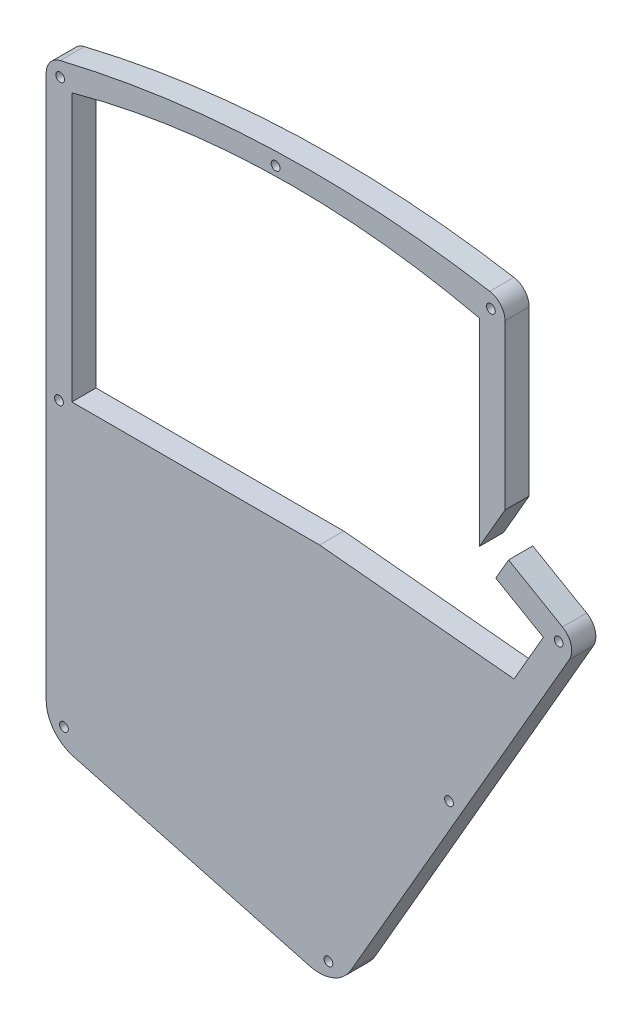
ISO-10303-21;
HEADER;
FILE_DESCRIPTION(('STEP AP214'),'2;1');
FILE_NAME('part.step','',(''),(''),'','','');
FILE_SCHEMA(('AUTOMOTIVE_DESIGN { 1 0 10303 214 1 1 1 1 }'));
ENDSEC;
DATA;
#1=APPLICATION_CONTEXT('core data for automotive mechanical design processes');
#2=APPLICATION_PROTOCOL_DEFINITION('international standard','automotive_design',2000,#1);
#3=PRODUCT_CONTEXT('',#1,'mechanical');
#4=PRODUCT('Part','Part','',(#3));
#5=PRODUCT_RELATED_PRODUCT_CATEGORY('part','',(#4));
#6=PRODUCT_DEFINITION_FORMATION('','',#4);
#7=PRODUCT_DEFINITION_CONTEXT('part definition',#1,'design');
#8=PRODUCT_DEFINITION('design','',#6,#7);
#9=PRODUCT_DEFINITION_SHAPE('','',#8);
#10=(LENGTH_UNIT() NAMED_UNIT(*) SI_UNIT(.MILLI.,.METRE.));
#11=(NAMED_UNIT(*) PLANE_ANGLE_UNIT() SI_UNIT($,.RADIAN.));
#12=(NAMED_UNIT(*) SI_UNIT($,.STERADIAN.) SOLID_ANGLE_UNIT());
#13=UNCERTAINTY_MEASURE_WITH_UNIT(LENGTH_MEASURE(1.E-05),#10,'distance_accuracy_value','');
#14=(GEOMETRIC_REPRESENTATION_CONTEXT(3) GLOBAL_UNCERTAINTY_ASSIGNED_CONTEXT((#13)) GLOBAL_UNIT_ASSIGNED_CONTEXT((#10,
#11,#12)) REPRESENTATION_CONTEXT('',''));
#15=CARTESIAN_POINT('',(0.,0.,0.));
#16=DIRECTION('',(0.,0.,1.));
#17=DIRECTION('',(1.,0.,0.));
#18=AXIS2_PLACEMENT_3D('',#15,#16,#17);
#19=CARTESIAN_POINT('',(125.71136232889,38.9855806030634,-6.6));
#20=DIRECTION('',(1.,0.,0.));
#21=DIRECTION('',(0.,0.,-1.));
#22=AXIS2_PLACEMENT_3D('',#19,#20,#21);
#23=PLANE('',#22);
#24=DIRECTION('',(0.,1.,0.));
#25=VECTOR('',#24,1.);
#26=CARTESIAN_POINT('',(125.71136232889,38.9855806030634,0.));
#27=LINE('',#26,#25);
#28=CARTESIAN_POINT('',(125.71136232889,49.7135406162242,0.));
#29=VERTEX_POINT('',#28);
#30=CARTESIAN_POINT('',(125.71136232889,94.4173790936413,0.));
#31=VERTEX_POINT('',#30);
#32=EDGE_CURVE('E201',#29,#31,#27,.T.);
#33=ORIENTED_EDGE('',*,*,#32,.F.);
#34=DIRECTION('',(0.,0.,-1.));
#35=VECTOR('',#34,1.);
#36=CARTESIAN_POINT('',(125.71136232889,49.7135406162242,-6.6));
#37=LINE('',#36,#35);
#38=CARTESIAN_POINT('',(125.71136232889,49.7135406162242,-6.6));
#39=VERTEX_POINT('',#38);
#40=EDGE_CURVE('E194',#39,#29,#37,.F.);
#41=ORIENTED_EDGE('',*,*,#40,.F.);
#42=DIRECTION('',(0.,1.,0.));
#43=VECTOR('',#42,1.);
#44=CARTESIAN_POINT('',(125.71136232889,38.9855806030634,-6.6));
#45=LINE('',#44,#43);
#46=CARTESIAN_POINT('',(125.71136232889,94.4173790936413,-6.6));
#47=VERTEX_POINT('',#46);
#48=EDGE_CURVE('E278',#39,#47,#45,.T.);
#49=ORIENTED_EDGE('',*,*,#48,.T.);
#50=DIRECTION('',(0.,0.,1.));
#51=VECTOR('',#50,1.);
#52=CARTESIAN_POINT('',(125.71136232889,94.4173790936413,-6.6));
#53=LINE('',#52,#51);
#54=EDGE_CURVE('E244',#47,#31,#53,.T.);
#55=ORIENTED_EDGE('',*,*,#54,.T.);
#56=EDGE_LOOP('',(#33,#41,#49,#55));
#57=FACE_BOUND('',#56,.T.);
#58=ADVANCED_FACE('F39',(#57),#23,.T.);
#59=CARTESIAN_POINT('',(141.417616366734,29.9175706063536,-6.6));
#60=DIRECTION('',(0.5,0.866025403784439,0.));
#61=DIRECTION('',(-0.866025403784439,0.5,0.));
#62=AXIS2_PLACEMENT_3D('',#59,#60,#61);
#63=PLANE('',#62);
#64=DIRECTION('',(-0.866025403784439,0.5,0.));
#65=VECTOR('',#64,1.);
#66=CARTESIAN_POINT('',(141.417616366734,29.9175706063536,-6.6));
#67=LINE('',#66,#65);
#68=CARTESIAN_POINT('',(141.417616366734,29.9175706063536,-6.6));
#69=VERTEX_POINT('',#68);
#70=CARTESIAN_POINT('',(126.695184502399,38.4175706063536,-6.6));
#71=VERTEX_POINT('',#70);
#72=EDGE_CURVE('E193',#69,#71,#67,.T.);
#73=ORIENTED_EDGE('',*,*,#72,.T.);
#74=DIRECTION('',(0.,0.,-1.));
#75=VECTOR('',#74,1.);
#76=CARTESIAN_POINT('',(126.695184502399,38.4175706063536,-6.6));
#77=LINE('',#76,#75);
#78=CARTESIAN_POINT('',(126.695184502399,38.4175706063536,0.));
#79=VERTEX_POINT('',#78);
#80=EDGE_CURVE('E178',#71,#79,#77,.F.);
#81=ORIENTED_EDGE('',*,*,#80,.T.);
#82=DIRECTION('',(-0.866025403784439,0.5,0.));
#83=VECTOR('',#82,1.);
#84=CARTESIAN_POINT('',(141.417616366734,29.9175706063536,0.));
#85=LINE('',#84,#83);
#86=CARTESIAN_POINT('',(141.417616366734,29.9175706063536,0.));
#87=VERTEX_POINT('',#86);
#88=EDGE_CURVE('E190',#87,#79,#85,.T.);
#89=ORIENTED_EDGE('',*,*,#88,.F.);
#90=DIRECTION('',(0.,0.,1.));
#91=VECTOR('',#90,1.);
#92=CARTESIAN_POINT('',(141.417616366734,29.9175706063536,-6.6));
#93=LINE('',#92,#91);
#94=EDGE_CURVE('E43',#69,#87,#93,.T.);
#95=ORIENTED_EDGE('',*,*,#94,.F.);
#96=EDGE_LOOP('',(#73,#81,#89,#95));
#97=FACE_BOUND('',#96,.T.);
#98=ADVANCED_FACE('F189',(#97),#63,.T.);
#99=CARTESIAN_POINT('',(138.917616366734,25.5874435874314,-6.6));
#100=DIRECTION('',(0.,0.,1.));
#101=DIRECTION('',(1.,0.,0.));
#102=AXIS2_PLACEMENT_3D('',#99,#100,#101);
#103=PLANE('',#102);
#104=CARTESIAN_POINT('',(3.96136232889021,14.788842394294,-6.6));
#105=DIRECTION('',(0.,0.,1.));
#106=DIRECTION('',(1.,0.,0.));
#107=AXIS2_PLACEMENT_3D('',#104,#105,#106);
#108=CIRCLE('',#107,1.2);
#109=CARTESIAN_POINT('',(5.16136232889021,14.788842394294,-6.6));
#110=VERTEX_POINT('',#109);
#111=EDGE_CURVE('E205',#110,#110,#108,.T.);
#112=ORIENTED_EDGE('',*,*,#111,.T.);
#113=EDGE_LOOP('',(#112));
#114=FACE_BOUND('',#113,.T.);
#115=CARTESIAN_POINT('',(5.30456561699719,-61.7478219517398,-6.6));
#116=DIRECTION('',(0.,0.,1.));
#117=DIRECTION('',(1.,0.,0.));
#118=AXIS2_PLACEMENT_3D('',#115,#116,#117);
#119=CIRCLE('',#118,1.2);
#120=CARTESIAN_POINT('',(6.50456561699719,-61.7478219517398,-6.6));
#121=VERTEX_POINT('',#120);
#122=EDGE_CURVE('E287',#121,#121,#119,.T.);
#123=ORIENTED_EDGE('',*,*,#122,.T.);
#124=EDGE_LOOP('',(#123));
#125=FACE_BOUND('',#124,.T.);
#126=CARTESIAN_POINT('',(77.5060257857162,-81.0941448962959,-6.6));
#127=DIRECTION('',(0.,0.,1.));
#128=DIRECTION('',(1.,0.,0.));
#129=AXIS2_PLACEMENT_3D('',#126,#127,#128);
#130=CIRCLE('',#129,1.2);
#131=CARTESIAN_POINT('',(78.7060257857162,-81.0941448962959,-6.6));
#132=VERTEX_POINT('',#131);
#133=EDGE_CURVE('E293',#132,#132,#130,.T.);
#134=ORIENTED_EDGE('',*,*,#133,.T.);
#135=EDGE_LOOP('',(#134));
#136=FACE_BOUND('',#135,.T.);
#137=CARTESIAN_POINT('',(110.432201536176,-26.7507421737706,-6.6));
#138=DIRECTION('',(0.,0.,1.));
#139=DIRECTION('',(1.,0.,0.));
#140=AXIS2_PLACEMENT_3D('',#137,#138,#139);
#141=CIRCLE('',#140,1.2);
#142=CARTESIAN_POINT('',(111.632201536176,-26.7507421737706,-6.6));
#143=VERTEX_POINT('',#142);
#144=EDGE_CURVE('E299',#143,#143,#141,.T.);
#145=ORIENTED_EDGE('',*,*,#144,.T.);
#146=EDGE_LOOP('',(#145));
#147=FACE_BOUND('',#146,.T.);
#148=CARTESIAN_POINT('',(140.366505106168,25.9756721550852,-6.6));
#149=DIRECTION('',(0.,0.,1.));
#150=DIRECTION('',(1.,0.,0.));
#151=AXIS2_PLACEMENT_3D('',#148,#149,#150);
#152=CIRCLE('',#151,1.20000000000001);
#153=CARTESIAN_POINT('',(141.566505106168,25.9756721550852,-6.6));
#154=VERTEX_POINT('',#153);
#155=EDGE_CURVE('E305',#154,#154,#152,.T.);
#156=ORIENTED_EDGE('',*,*,#155,.T.);
#157=EDGE_LOOP('',(#156));
#158=FACE_BOUND('',#157,.T.);
#159=CARTESIAN_POINT('',(121.857138977799,95.3854678658184,-6.6));
#160=DIRECTION('',(0.,0.,1.));
#161=DIRECTION('',(1.,0.,0.));
#162=AXIS2_PLACEMENT_3D('',#159,#160,#161);
#163=CIRCLE('',#162,1.2);
#164=CARTESIAN_POINT('',(123.057138977799,95.3854678658184,-6.6));
#165=VERTEX_POINT('',#164);
#166=EDGE_CURVE('E311',#165,#165,#163,.T.);
#167=ORIENTED_EDGE('',*,*,#166,.T.);
#168=EDGE_LOOP('',(#167));
#169=FACE_BOUND('',#168,.T.);
#170=CARTESIAN_POINT('',(63.0863623288902,99.772576472601,-6.6));
#171=DIRECTION('',(0.,0.,1.));
#172=DIRECTION('',(1.,0.,0.));
#173=AXIS2_PLACEMENT_3D('',#170,#171,#172);
#174=CIRCLE('',#173,1.19999999999999);
#175=CARTESIAN_POINT('',(64.2863623288902,99.772576472601,-6.6));
#176=VERTEX_POINT('',#175);
#177=EDGE_CURVE('E317',#176,#176,#174,.T.);
#178=ORIENTED_EDGE('',*,*,#177,.T.);
#179=EDGE_LOOP('',(#178));
#180=FACE_BOUND('',#179,.T.);
#181=CARTESIAN_POINT('',(4.28253949461192,91.3255067403277,-6.6));
#182=DIRECTION('',(0.,0.,1.));
#183=DIRECTION('',(1.,0.,0.));
#184=AXIS2_PLACEMENT_3D('',#181,#182,#183);
#185=CIRCLE('',#184,1.2);
#186=CARTESIAN_POINT('',(5.48253949461192,91.3255067403277,-6.6));
#187=VERTEX_POINT('',#186);
#188=EDGE_CURVE('E323',#187,#187,#185,.T.);
#189=ORIENTED_EDGE('',*,*,#188,.T.);
#190=EDGE_LOOP('',(#189));
#191=FACE_BOUND('',#190,.T.);
#192=DIRECTION('',(0.5,0.866025403784439,0.));
#193=VECTOR('',#192,1.);
#194=CARTESIAN_POINT('',(115.3160193778,31.7082784628326,-6.6));
#195=LINE('',#194,#193);
#196=CARTESIAN_POINT('',(118.71136232889,37.5891849632421,-6.6));
#197=VERTEX_POINT('',#196);
#198=EDGE_CURVE('E184',#197,#39,#195,.T.);
#199=ORIENTED_EDGE('',*,*,#198,.F.);
#200=DIRECTION('',(0.,-1.,0.));
#201=VECTOR('',#200,1.);
#202=CARTESIAN_POINT('',(118.71136232889,91.6108574570273,-6.6));
#203=LINE('',#202,#201);
#204=CARTESIAN_POINT('',(118.71136232889,91.6108574570272,-6.6));
#205=VERTEX_POINT('',#204);
#206=EDGE_CURVE('E378',#205,#197,#203,.T.);
#207=ORIENTED_EDGE('',*,*,#206,.F.);
#208=CARTESIAN_POINT('',(67.8020092626523,-130.467472598143,-6.6));
#209=DIRECTION('',(0.,0.,1.));
#210=DIRECTION('',(1.,0.,0.));
#211=AXIS2_PLACEMENT_3D('',#208,#209,#210);
#212=CIRCLE('',#211,227.838861719673);
#213=CARTESIAN_POINT('',(7.46136232889021,89.2358574570272,-6.6));
#214=VERTEX_POINT('',#213);
#215=EDGE_CURVE('E375',#214,#205,#212,.F.);
#216=ORIENTED_EDGE('',*,*,#215,.F.);
#217=DIRECTION('',(0.,1.,0.));
#218=VECTOR('',#217,1.);
#219=CARTESIAN_POINT('',(7.46136232889021,16.1358574570272,-6.6));
#220=LINE('',#219,#218);
#221=CARTESIAN_POINT('',(7.46136232889021,16.1358574570272,-6.6));
#222=VERTEX_POINT('',#221);
#223=EDGE_CURVE('E372',#222,#214,#220,.T.);
#224=ORIENTED_EDGE('',*,*,#223,.F.);
#225=DIRECTION('',(-1.,0.,0.));
#226=VECTOR('',#225,1.);
#227=CARTESIAN_POINT('',(75.1123623288902,16.1358574570272,-6.6));
#228=LINE('',#227,#226);
#229=CARTESIAN_POINT('',(75.1123623288902,16.1358574570272,-6.6));
#230=VERTEX_POINT('',#229);
#231=EDGE_CURVE('E369',#230,#222,#228,.T.);
#232=ORIENTED_EDGE('',*,*,#231,.F.);
#233=DIRECTION('',(-0.995348656445925,0.0963382172935161,0.));
#234=VECTOR('',#233,1.);
#235=CARTESIAN_POINT('',(128.185565559165,10.9989863193115,-6.6));
#236=LINE('',#235,#234);
#237=CARTESIAN_POINT('',(128.185565559165,10.9989863193115,-6.6));
#238=VERTEX_POINT('',#237);
#239=EDGE_CURVE('E366',#238,#230,#236,.T.);
#240=ORIENTED_EDGE('',*,*,#239,.F.);
#241=DIRECTION('',(-0.500000000000002,-0.866025403784438,0.));
#242=VECTOR('',#241,1.);
#243=CARTESIAN_POINT('',(136.185565559165,24.8553927798626,-6.6));
#244=LINE('',#243,#242);
#245=CARTESIAN_POINT('',(136.185565559165,24.8553927798626,-6.6));
#246=VERTEX_POINT('',#245);
#247=EDGE_CURVE('E363',#246,#238,#244,.T.);
#248=ORIENTED_EDGE('',*,*,#247,.F.);
#249=DIRECTION('',(0.866025403784439,-0.5,0.));
#250=VECTOR('',#249,1.);
#251=CARTESIAN_POINT('',(118.71136232889,34.9441287187361,-6.6));
#252=LINE('',#251,#250);
#253=CARTESIAN_POINT('',(123.195184502399,32.3553927798626,-6.6));
#254=VERTEX_POINT('',#253);
#255=EDGE_CURVE('E329',#254,#246,#252,.T.);
#256=ORIENTED_EDGE('',*,*,#255,.F.);
#257=DIRECTION('',(-0.5,-0.866025403784439,0.));
#258=VECTOR('',#257,1.);
#259=CARTESIAN_POINT('',(120.945184502399,28.4582784628326,-6.6));
#260=LINE('',#259,#258);
#261=EDGE_CURVE('E64',#71,#254,#260,.T.);
#262=ORIENTED_EDGE('',*,*,#261,.F.);
#263=ORIENTED_EDGE('',*,*,#72,.F.);
#264=CARTESIAN_POINT('',(138.917616366734,25.5874435874314,-6.6));
#265=DIRECTION('',(0.,0.,1.));
#266=DIRECTION('',(1.,0.,0.));
#267=AXIS2_PLACEMENT_3D('',#264,#265,#266);
#268=CIRCLE('',#267,5.00000000000001);
#269=CARTESIAN_POINT('',(143.247743385656,23.0874435874314,-6.6));
#270=VERTEX_POINT('',#269);
#271=EDGE_CURVE('E230',#270,#69,#268,.T.);
#272=ORIENTED_EDGE('',*,*,#271,.F.);
#273=DIRECTION('',(0.5,0.866025403784439,0.));
#274=VECTOR('',#273,1.);
#275=CARTESIAN_POINT('',(83.6788375131875,-80.0889279349726,-6.6));
#276=LINE('',#275,#274);
#277=CARTESIAN_POINT('',(83.6788375131875,-80.0889279349726,-6.6));
#278=VERTEX_POINT('',#277);
#279=EDGE_CURVE('E250',#278,#270,#276,.T.);
#280=ORIENTED_EDGE('',*,*,#279,.F.);
#281=CARTESIAN_POINT('',(75.0185834753431,-75.0889279349726,-6.6));
#282=DIRECTION('',(0.,0.,1.));
#283=DIRECTION('',(1.,0.,0.));
#284=AXIS2_PLACEMENT_3D('',#281,#282,#283);
#285=CIRCLE('',#284,10.);
#286=CARTESIAN_POINT('',(72.430393024318,-84.7481861978633,-6.6));
#287=VERTEX_POINT('',#286);
#288=EDGE_CURVE('E254',#287,#278,#285,.T.);
#289=ORIENTED_EDGE('',*,*,#288,.F.);
#290=DIRECTION('',(0.965925826289068,-0.258819045102521,0.));
#291=VECTOR('',#290,1.);
#292=CARTESIAN_POINT('',(7.87317187786502,-67.4501309260738,-6.6));
#293=LINE('',#292,#291);
#294=CARTESIAN_POINT('',(7.87317187786502,-67.4501309260738,-6.6));
#295=VERTEX_POINT('',#294);
#296=EDGE_CURVE('E258',#295,#287,#293,.T.);
#297=ORIENTED_EDGE('',*,*,#296,.F.);
#298=CARTESIAN_POINT('',(10.4613623288902,-57.7908726631831,-6.6));
#299=DIRECTION('',(0.,0.,1.));
#300=DIRECTION('',(1.,0.,0.));
#301=AXIS2_PLACEMENT_3D('',#298,#299,#300);
#302=CIRCLE('',#301,10.);
#303=CARTESIAN_POINT('',(0.461362328890224,-57.7908726631831,-6.6));
#304=VERTEX_POINT('',#303);
#305=EDGE_CURVE('E263',#304,#295,#302,.T.);
#306=ORIENTED_EDGE('',*,*,#305,.F.);
#307=DIRECTION('',(0.,-1.,0.));
#308=VECTOR('',#307,1.);
#309=CARTESIAN_POINT('',(0.461362328890208,90.3979417963027,-6.6));
#310=LINE('',#309,#308);
#311=CARTESIAN_POINT('',(0.461362328890208,90.3979417963027,-6.6));
#312=VERTEX_POINT('',#311);
#313=EDGE_CURVE('E266',#312,#304,#310,.T.);
#314=ORIENTED_EDGE('',*,*,#313,.F.);
#315=CARTESIAN_POINT('',(5.46136232889022,90.3979417963027,-6.6));
#316=DIRECTION('',(0.,0.,1.));
#317=DIRECTION('',(-1.,0.,0.));
#318=AXIS2_PLACEMENT_3D('',#315,#316,#317);
#319=CIRCLE('',#318,5.00000000000001);
#320=CARTESIAN_POINT('',(4.28525888615277,95.2576517353815,-6.6));
#321=VERTEX_POINT('',#320);
#322=EDGE_CURVE('E269',#321,#312,#319,.T.);
#323=ORIENTED_EDGE('',*,*,#322,.F.);
#324=CARTESIAN_POINT('',(72.8707016909715,-188.14034368151,-6.6));
#325=DIRECTION('',(0.,0.,1.));
#326=DIRECTION('',(-1.,0.,0.));
#327=AXIS2_PLACEMENT_3D('',#324,#325,#326);
#328=CIRCLE('',#327,291.579126089378);
#329=CARTESIAN_POINT('',(121.546047347488,99.3472169124471,-6.6));
#330=VERTEX_POINT('',#329);
#331=EDGE_CURVE('E272',#330,#321,#328,.T.);
#332=ORIENTED_EDGE('',*,*,#331,.F.);
#333=CARTESIAN_POINT('',(120.71136232889,94.4173790936413,-6.6));
#334=DIRECTION('',(0.,0.,1.));
#335=DIRECTION('',(1.,0.,0.));
#336=AXIS2_PLACEMENT_3D('',#333,#334,#335);
#337=CIRCLE('',#336,5.00000000000001);
#338=EDGE_CURVE('E275',#47,#330,#337,.T.);
#339=ORIENTED_EDGE('',*,*,#338,.F.);
#340=ORIENTED_EDGE('',*,*,#48,.F.);
#341=EDGE_LOOP('',(#199,#207,#216,#224,#232,#240,#248,#256,#262,#263,#272,#280,#289,#297,#306,
#314,#323,#332,#339,#340));
#342=FACE_BOUND('',#341,.T.);
#343=ADVANCED_FACE('F393',(#114,#125,#136,#147,#158,#169,#180,#191,#342),#103,.F.);
#344=CARTESIAN_POINT('',(138.917616366734,25.5874435874314,0.));
#345=DIRECTION('',(0.,0.,1.));
#346=DIRECTION('',(1.,0.,0.));
#347=AXIS2_PLACEMENT_3D('',#344,#345,#346);
#348=PLANE('',#347);
#349=CARTESIAN_POINT('',(4.28253949461192,91.3255067403277,0.));
#350=DIRECTION('',(0.,0.,1.));
#351=DIRECTION('',(1.,0.,0.));
#352=AXIS2_PLACEMENT_3D('',#349,#350,#351);
#353=CIRCLE('',#352,1.2);
#354=CARTESIAN_POINT('',(5.48253949461192,91.3255067403277,0.));
#355=VERTEX_POINT('',#354);
#356=EDGE_CURVE('E326',#355,#355,#353,.T.);
#357=ORIENTED_EDGE('',*,*,#356,.F.);
#358=EDGE_LOOP('',(#357));
#359=FACE_BOUND('',#358,.T.);
#360=CARTESIAN_POINT('',(63.0863623288902,99.772576472601,0.));
#361=DIRECTION('',(0.,0.,1.));
#362=DIRECTION('',(1.,0.,0.));
#363=AXIS2_PLACEMENT_3D('',#360,#361,#362);
#364=CIRCLE('',#363,1.19999999999999);
#365=CARTESIAN_POINT('',(64.2863623288902,99.772576472601,0.));
#366=VERTEX_POINT('',#365);
#367=EDGE_CURVE('E320',#366,#366,#364,.T.);
#368=ORIENTED_EDGE('',*,*,#367,.F.);
#369=EDGE_LOOP('',(#368));
#370=FACE_BOUND('',#369,.T.);
#371=CARTESIAN_POINT('',(121.857138977799,95.3854678658184,0.));
#372=DIRECTION('',(0.,0.,1.));
#373=DIRECTION('',(1.,0.,0.));
#374=AXIS2_PLACEMENT_3D('',#371,#372,#373);
#375=CIRCLE('',#374,1.20000000000001);
#376=CARTESIAN_POINT('',(123.057138977799,95.3854678658184,0.));
#377=VERTEX_POINT('',#376);
#378=EDGE_CURVE('E314',#377,#377,#375,.T.);
#379=ORIENTED_EDGE('',*,*,#378,.F.);
#380=EDGE_LOOP('',(#379));
#381=FACE_BOUND('',#380,.T.);
#382=CARTESIAN_POINT('',(140.366505106168,25.9756721550852,0.));
#383=DIRECTION('',(0.,0.,1.));
#384=DIRECTION('',(1.,0.,0.));
#385=AXIS2_PLACEMENT_3D('',#382,#383,#384);
#386=CIRCLE('',#385,1.20000000000001);
#387=CARTESIAN_POINT('',(141.566505106168,25.9756721550852,0.));
#388=VERTEX_POINT('',#387);
#389=EDGE_CURVE('E308',#388,#388,#386,.T.);
#390=ORIENTED_EDGE('',*,*,#389,.F.);
#391=EDGE_LOOP('',(#390));
#392=FACE_BOUND('',#391,.T.);
#393=CARTESIAN_POINT('',(110.432201536176,-26.7507421737706,0.));
#394=DIRECTION('',(0.,0.,1.));
#395=DIRECTION('',(1.,0.,0.));
#396=AXIS2_PLACEMENT_3D('',#393,#394,#395);
#397=CIRCLE('',#396,1.20000000000001);
#398=CARTESIAN_POINT('',(111.632201536176,-26.7507421737706,0.));
#399=VERTEX_POINT('',#398);
#400=EDGE_CURVE('E302',#399,#399,#397,.T.);
#401=ORIENTED_EDGE('',*,*,#400,.F.);
#402=EDGE_LOOP('',(#401));
#403=FACE_BOUND('',#402,.T.);
#404=CARTESIAN_POINT('',(77.5060257857162,-81.0941448962959,0.));
#405=DIRECTION('',(0.,0.,1.));
#406=DIRECTION('',(1.,0.,0.));
#407=AXIS2_PLACEMENT_3D('',#404,#405,#406);
#408=CIRCLE('',#407,1.20000000000001);
#409=CARTESIAN_POINT('',(78.7060257857162,-81.0941448962959,0.));
#410=VERTEX_POINT('',#409);
#411=EDGE_CURVE('E296',#410,#410,#408,.T.);
#412=ORIENTED_EDGE('',*,*,#411,.F.);
#413=EDGE_LOOP('',(#412));
#414=FACE_BOUND('',#413,.T.);
#415=CARTESIAN_POINT('',(5.30456561699719,-61.7478219517398,0.));
#416=DIRECTION('',(0.,0.,1.));
#417=DIRECTION('',(1.,0.,0.));
#418=AXIS2_PLACEMENT_3D('',#415,#416,#417);
#419=CIRCLE('',#418,1.2);
#420=CARTESIAN_POINT('',(6.50456561699719,-61.7478219517398,0.));
#421=VERTEX_POINT('',#420);
#422=EDGE_CURVE('E290',#421,#421,#419,.T.);
#423=ORIENTED_EDGE('',*,*,#422,.F.);
#424=EDGE_LOOP('',(#423));
#425=FACE_BOUND('',#424,.T.);
#426=CARTESIAN_POINT('',(3.96136232889021,14.788842394294,0.));
#427=DIRECTION('',(0.,0.,1.));
#428=DIRECTION('',(1.,0.,0.));
#429=AXIS2_PLACEMENT_3D('',#426,#427,#428);
#430=CIRCLE('',#429,1.2);
#431=CARTESIAN_POINT('',(5.16136232889021,14.788842394294,0.));
#432=VERTEX_POINT('',#431);
#433=EDGE_CURVE('E284',#432,#432,#430,.T.);
#434=ORIENTED_EDGE('',*,*,#433,.F.);
#435=EDGE_LOOP('',(#434));
#436=FACE_BOUND('',#435,.T.);
#437=DIRECTION('',(0.,1.,0.));
#438=VECTOR('',#437,1.);
#439=CARTESIAN_POINT('',(118.71136232889,91.6108574570273,0.));
#440=LINE('',#439,#438);
#441=CARTESIAN_POINT('',(118.71136232889,37.5891849632421,0.));
#442=VERTEX_POINT('',#441);
#443=CARTESIAN_POINT('',(118.71136232889,91.6108574570272,0.));
#444=VERTEX_POINT('',#443);
#445=EDGE_CURVE('E357',#442,#444,#440,.T.);
#446=ORIENTED_EDGE('',*,*,#445,.F.);
#447=DIRECTION('',(0.5,0.866025403784439,0.));
#448=VECTOR('',#447,1.);
#449=CARTESIAN_POINT('',(115.3160193778,31.7082784628326,0.));
#450=LINE('',#449,#448);
#451=EDGE_CURVE('E56',#442,#29,#450,.T.);
#452=ORIENTED_EDGE('',*,*,#451,.T.);
#453=ORIENTED_EDGE('',*,*,#32,.T.);
#454=CARTESIAN_POINT('',(120.71136232889,94.4173790936413,0.));
#455=DIRECTION('',(0.,0.,1.));
#456=DIRECTION('',(1.,0.,0.));
#457=AXIS2_PLACEMENT_3D('',#454,#455,#456);
#458=CIRCLE('',#457,5.00000000000001);
#459=CARTESIAN_POINT('',(121.546047347488,99.3472169124471,0.));
#460=VERTEX_POINT('',#459);
#461=EDGE_CURVE('E203',#31,#460,#458,.T.);
#462=ORIENTED_EDGE('',*,*,#461,.T.);
#463=CARTESIAN_POINT('',(72.8707016909715,-188.14034368151,0.));
#464=DIRECTION('',(0.,0.,1.));
#465=DIRECTION('',(-1.,0.,0.));
#466=AXIS2_PLACEMENT_3D('',#463,#464,#465);
#467=CIRCLE('',#466,291.579126089378);
#468=CARTESIAN_POINT('',(4.28525888615277,95.2576517353815,0.));
#469=VERTEX_POINT('',#468);
#470=EDGE_CURVE('E211',#460,#469,#467,.T.);
#471=ORIENTED_EDGE('',*,*,#470,.T.);
#472=CARTESIAN_POINT('',(5.46136232889022,90.3979417963027,0.));
#473=DIRECTION('',(0.,0.,1.));
#474=DIRECTION('',(-1.,0.,0.));
#475=AXIS2_PLACEMENT_3D('',#472,#473,#474);
#476=CIRCLE('',#475,5.00000000000001);
#477=CARTESIAN_POINT('',(0.461362328890208,90.3979417963027,0.));
#478=VERTEX_POINT('',#477);
#479=EDGE_CURVE('E214',#469,#478,#476,.T.);
#480=ORIENTED_EDGE('',*,*,#479,.T.);
#481=DIRECTION('',(0.,-1.,0.));
#482=VECTOR('',#481,1.);
#483=CARTESIAN_POINT('',(0.461362328890208,90.3979417963027,0.));
#484=LINE('',#483,#482);
#485=CARTESIAN_POINT('',(0.461362328890224,-57.7908726631831,0.));
#486=VERTEX_POINT('',#485);
#487=EDGE_CURVE('E217',#478,#486,#484,.T.);
#488=ORIENTED_EDGE('',*,*,#487,.T.);
#489=CARTESIAN_POINT('',(10.4613623288902,-57.7908726631831,0.));
#490=DIRECTION('',(0.,0.,1.));
#491=DIRECTION('',(1.,0.,0.));
#492=AXIS2_PLACEMENT_3D('',#489,#490,#491);
#493=CIRCLE('',#492,10.);
#494=CARTESIAN_POINT('',(7.87317187786502,-67.4501309260738,0.));
#495=VERTEX_POINT('',#494);
#496=EDGE_CURVE('E220',#486,#495,#493,.T.);
#497=ORIENTED_EDGE('',*,*,#496,.T.);
#498=DIRECTION('',(0.965925826289068,-0.258819045102521,0.));
#499=VECTOR('',#498,1.);
#500=CARTESIAN_POINT('',(7.87317187786502,-67.4501309260738,0.));
#501=LINE('',#500,#499);
#502=CARTESIAN_POINT('',(72.430393024318,-84.7481861978633,0.));
#503=VERTEX_POINT('',#502);
#504=EDGE_CURVE('E223',#495,#503,#501,.T.);
#505=ORIENTED_EDGE('',*,*,#504,.T.);
#506=CARTESIAN_POINT('',(75.0185834753431,-75.0889279349726,0.));
#507=DIRECTION('',(0.,0.,1.));
#508=DIRECTION('',(1.,0.,0.));
#509=AXIS2_PLACEMENT_3D('',#506,#507,#508);
#510=CIRCLE('',#509,10.);
#511=CARTESIAN_POINT('',(83.6788375131875,-80.0889279349726,0.));
#512=VERTEX_POINT('',#511);
#513=EDGE_CURVE('E226',#503,#512,#510,.T.);
#514=ORIENTED_EDGE('',*,*,#513,.T.);
#515=DIRECTION('',(0.5,0.866025403784439,0.));
#516=VECTOR('',#515,1.);
#517=CARTESIAN_POINT('',(83.6788375131875,-80.0889279349726,0.));
#518=LINE('',#517,#516);
#519=CARTESIAN_POINT('',(143.247743385656,23.0874435874314,0.));
#520=VERTEX_POINT('',#519);
#521=EDGE_CURVE('E229',#512,#520,#518,.T.);
#522=ORIENTED_EDGE('',*,*,#521,.T.);
#523=CARTESIAN_POINT('',(138.917616366734,25.5874435874314,0.));
#524=DIRECTION('',(0.,0.,1.));
#525=DIRECTION('',(1.,0.,0.));
#526=AXIS2_PLACEMENT_3D('',#523,#524,#525);
#527=CIRCLE('',#526,5.00000000000001);
#528=EDGE_CURVE('E200',#520,#87,#527,.T.);
#529=ORIENTED_EDGE('',*,*,#528,.T.);
#530=ORIENTED_EDGE('',*,*,#88,.T.);
#531=DIRECTION('',(-0.5,-0.866025403784439,0.));
#532=VECTOR('',#531,1.);
#533=CARTESIAN_POINT('',(120.945184502399,28.4582784628326,0.));
#534=LINE('',#533,#532);
#535=CARTESIAN_POINT('',(123.195184502399,32.3553927798626,0.));
#536=VERTEX_POINT('',#535);
#537=EDGE_CURVE('E175',#79,#536,#534,.T.);
#538=ORIENTED_EDGE('',*,*,#537,.T.);
#539=DIRECTION('',(-0.866025403784439,0.5,0.));
#540=VECTOR('',#539,1.);
#541=CARTESIAN_POINT('',(118.71136232889,34.9441287187361,0.));
#542=LINE('',#541,#540);
#543=CARTESIAN_POINT('',(136.185565559165,24.8553927798625,0.));
#544=VERTEX_POINT('',#543);
#545=EDGE_CURVE('E359',#544,#536,#542,.T.);
#546=ORIENTED_EDGE('',*,*,#545,.F.);
#547=DIRECTION('',(0.500000000000002,0.866025403784438,0.));
#548=VECTOR('',#547,1.);
#549=CARTESIAN_POINT('',(136.185565559165,24.8553927798626,0.));
#550=LINE('',#549,#548);
#551=CARTESIAN_POINT('',(128.185565559165,10.9989863193115,0.));
#552=VERTEX_POINT('',#551);
#553=EDGE_CURVE('E361',#552,#544,#550,.T.);
#554=ORIENTED_EDGE('',*,*,#553,.F.);
#555=DIRECTION('',(0.995348656445925,-0.0963382172935161,0.));
#556=VECTOR('',#555,1.);
#557=CARTESIAN_POINT('',(128.185565559165,10.9989863193115,0.));
#558=LINE('',#557,#556);
#559=CARTESIAN_POINT('',(75.1123623288902,16.1358574570272,0.));
#560=VERTEX_POINT('',#559);
#561=EDGE_CURVE('E336',#560,#552,#558,.T.);
#562=ORIENTED_EDGE('',*,*,#561,.F.);
#563=DIRECTION('',(1.,0.,0.));
#564=VECTOR('',#563,1.);
#565=CARTESIAN_POINT('',(75.1123623288902,16.1358574570272,0.));
#566=LINE('',#565,#564);
#567=CARTESIAN_POINT('',(7.46136232889021,16.1358574570272,0.));
#568=VERTEX_POINT('',#567);
#569=EDGE_CURVE('E348',#568,#560,#566,.T.);
#570=ORIENTED_EDGE('',*,*,#569,.F.);
#571=DIRECTION('',(0.,-1.,0.));
#572=VECTOR('',#571,1.);
#573=CARTESIAN_POINT('',(7.46136232889021,16.1358574570272,0.));
#574=LINE('',#573,#572);
#575=CARTESIAN_POINT('',(7.46136232889021,89.2358574570272,0.));
#576=VERTEX_POINT('',#575);
#577=EDGE_CURVE('E351',#576,#568,#574,.T.);
#578=ORIENTED_EDGE('',*,*,#577,.F.);
#579=CARTESIAN_POINT('',(67.8020092626523,-130.467472598143,0.));
#580=DIRECTION('',(0.,0.,1.));
#581=DIRECTION('',(-1.,0.,0.));
#582=AXIS2_PLACEMENT_3D('',#579,#580,#581);
#583=CIRCLE('',#582,227.838861719673);
#584=EDGE_CURVE('E354',#444,#576,#583,.T.);
#585=ORIENTED_EDGE('',*,*,#584,.F.);
#586=EDGE_LOOP('',(#446,#452,#453,#462,#471,#480,#488,#497,#505,#514,#522,#529,#530,#538,#546,
#554,#562,#570,#578,#585));
#587=FACE_BOUND('',#586,.T.);
#588=ADVANCED_FACE('F197',(#359,#370,#381,#392,#403,#414,#425,#436,#587),#348,.T.);
#589=CARTESIAN_POINT('',(118.71136232889,91.6108574570273,-6.601));
#590=DIRECTION('',(1.,0.,0.));
#591=DIRECTION('',(0.,0.,-1.));
#592=AXIS2_PLACEMENT_3D('',#589,#590,#591);
#593=PLANE('',#592);
#594=DIRECTION('',(0.,0.,-1.));
#595=VECTOR('',#594,1.);
#596=CARTESIAN_POINT('',(118.71136232889,37.5891849632421,-6.6));
#597=LINE('',#596,#595);
#598=EDGE_CURVE('E381',#197,#442,#597,.F.);
#599=ORIENTED_EDGE('',*,*,#598,.T.);
#600=ORIENTED_EDGE('',*,*,#445,.T.);
#601=DIRECTION('',(0.,0.,1.));
#602=VECTOR('',#601,1.);
#603=CARTESIAN_POINT('',(118.71136232889,91.6108574570272,-6.601));
#604=LINE('',#603,#602);
#605=EDGE_CURVE('E335',#205,#444,#604,.T.);
#606=ORIENTED_EDGE('',*,*,#605,.F.);
#607=ORIENTED_EDGE('',*,*,#206,.T.);
#608=EDGE_LOOP('',(#599,#600,#606,#607));
#609=FACE_BOUND('',#608,.T.);
#610=ADVANCED_FACE('F431',(#609),#593,.F.);
#611=CARTESIAN_POINT('',(118.71136232889,34.9441287187361,-6.601));
#612=DIRECTION('',(0.499999999999999,0.866025403784439,0.));
#613=DIRECTION('',(-0.866025403784439,0.5,0.));
#614=AXIS2_PLACEMENT_3D('',#611,#612,#613);
#615=PLANE('',#614);
#616=DIRECTION('',(0.,0.,-1.));
#617=VECTOR('',#616,1.);
#618=CARTESIAN_POINT('',(123.195184502399,32.3553927798626,-6.6));
#619=LINE('',#618,#617);
#620=EDGE_CURVE('E179',#254,#536,#619,.F.);
#621=ORIENTED_EDGE('',*,*,#620,.F.);
#622=ORIENTED_EDGE('',*,*,#255,.T.);
#623=DIRECTION('',(0.,0.,1.));
#624=VECTOR('',#623,1.);
#625=CARTESIAN_POINT('',(136.185565559165,24.8553927798626,-6.601));
#626=LINE('',#625,#624);
#627=EDGE_CURVE('E332',#246,#544,#626,.T.);
#628=ORIENTED_EDGE('',*,*,#627,.T.);
#629=ORIENTED_EDGE('',*,*,#545,.T.);
#630=EDGE_LOOP('',(#621,#622,#628,#629));
#631=FACE_BOUND('',#630,.T.);
#632=ADVANCED_FACE('F425',(#631),#615,.F.);
#633=CARTESIAN_POINT('',(138.917616366734,25.5874435874314,-6.6));
#634=DIRECTION('',(0.,0.,1.));
#635=DIRECTION('',(1.,0.,0.));
#636=AXIS2_PLACEMENT_3D('',#633,#634,#635);
#637=CYLINDRICAL_SURFACE('',#636,5.00000000000001);
#638=ORIENTED_EDGE('',*,*,#528,.F.);
#639=DIRECTION('',(0.,0.,1.));
#640=VECTOR('',#639,1.);
#641=CARTESIAN_POINT('',(143.247743385656,23.0874435874314,-6.6));
#642=LINE('',#641,#640);
#643=EDGE_CURVE('E11',#270,#520,#642,.T.);
#644=ORIENTED_EDGE('',*,*,#643,.F.);
#645=ORIENTED_EDGE('',*,*,#271,.T.);
#646=ORIENTED_EDGE('',*,*,#94,.T.);
#647=EDGE_LOOP('',(#638,#644,#645,#646));
#648=FACE_BOUND('',#647,.T.);
#649=ADVANCED_FACE('F41',(#648),#637,.T.);
#650=CARTESIAN_POINT('',(83.6788375131875,-80.0889279349726,-6.6));
#651=DIRECTION('',(0.866025403784439,-0.5,0.));
#652=DIRECTION('',(0.5,0.866025403784439,0.));
#653=AXIS2_PLACEMENT_3D('',#650,#651,#652);
#654=PLANE('',#653);
#655=ORIENTED_EDGE('',*,*,#521,.F.);
#656=DIRECTION('',(0.,0.,1.));
#657=VECTOR('',#656,1.);
#658=CARTESIAN_POINT('',(83.6788375131875,-80.0889279349726,-6.6));
#659=LINE('',#658,#657);
#660=EDGE_CURVE('E48',#278,#512,#659,.T.);
#661=ORIENTED_EDGE('',*,*,#660,.F.);
#662=ORIENTED_EDGE('',*,*,#279,.T.);
#663=ORIENTED_EDGE('',*,*,#643,.T.);
#664=EDGE_LOOP('',(#655,#661,#662,#663));
#665=FACE_BOUND('',#664,.T.);
#666=ADVANCED_FACE('F422',(#665),#654,.T.);
#667=CARTESIAN_POINT('',(75.0185834753431,-75.0889279349726,-6.6));
#668=DIRECTION('',(0.,0.,1.));
#669=DIRECTION('',(1.,0.,0.));
#670=AXIS2_PLACEMENT_3D('',#667,#668,#669);
#671=CYLINDRICAL_SURFACE('',#670,10.);
#672=ORIENTED_EDGE('',*,*,#513,.F.);
#673=DIRECTION('',(0.,0.,1.));
#674=VECTOR('',#673,1.);
#675=CARTESIAN_POINT('',(72.430393024318,-84.7481861978633,-6.6));
#676=LINE('',#675,#674);
#677=EDGE_CURVE('E233',#287,#503,#676,.T.);
#678=ORIENTED_EDGE('',*,*,#677,.F.);
#679=ORIENTED_EDGE('',*,*,#288,.T.);
#680=ORIENTED_EDGE('',*,*,#660,.T.);
#681=EDGE_LOOP('',(#672,#678,#679,#680));
#682=FACE_BOUND('',#681,.T.);
#683=ADVANCED_FACE('F420',(#682),#671,.T.);
#684=CARTESIAN_POINT('',(7.87317187786502,-67.4501309260738,-6.6));
#685=DIRECTION('',(-0.258819045102521,-0.965925826289068,0.));
#686=DIRECTION('',(0.965925826289068,-0.258819045102521,0.));
#687=AXIS2_PLACEMENT_3D('',#684,#685,#686);
#688=PLANE('',#687);
#689=ORIENTED_EDGE('',*,*,#504,.F.);
#690=DIRECTION('',(0.,0.,1.));
#691=VECTOR('',#690,1.);
#692=CARTESIAN_POINT('',(7.87317187786502,-67.4501309260738,-6.6));
#693=LINE('',#692,#691);
#694=EDGE_CURVE('E235',#295,#495,#693,.T.);
#695=ORIENTED_EDGE('',*,*,#694,.F.);
#696=ORIENTED_EDGE('',*,*,#296,.T.);
#697=ORIENTED_EDGE('',*,*,#677,.T.);
#698=EDGE_LOOP('',(#689,#695,#696,#697));
#699=FACE_BOUND('',#698,.T.);
#700=ADVANCED_FACE('F416',(#699),#688,.T.);
#701=CARTESIAN_POINT('',(10.4613623288902,-57.7908726631831,-6.6));
#702=DIRECTION('',(0.,0.,1.));
#703=DIRECTION('',(1.,0.,0.));
#704=AXIS2_PLACEMENT_3D('',#701,#702,#703);
#705=CYLINDRICAL_SURFACE('',#704,10.);
#706=ORIENTED_EDGE('',*,*,#496,.F.);
#707=DIRECTION('',(0.,0.,1.));
#708=VECTOR('',#707,1.);
#709=CARTESIAN_POINT('',(0.461362328890224,-57.7908726631831,-6.6));
#710=LINE('',#709,#708);
#711=EDGE_CURVE('E237',#304,#486,#710,.T.);
#712=ORIENTED_EDGE('',*,*,#711,.F.);
#713=ORIENTED_EDGE('',*,*,#305,.T.);
#714=ORIENTED_EDGE('',*,*,#694,.T.);
#715=EDGE_LOOP('',(#706,#712,#713,#714));
#716=FACE_BOUND('',#715,.T.);
#717=ADVANCED_FACE('F412',(#716),#705,.T.);
#718=CARTESIAN_POINT('',(0.461362328890208,90.3979417963027,-6.6));
#719=DIRECTION('',(-1.,0.,0.));
#720=DIRECTION('',(0.,-1.,0.));
#721=AXIS2_PLACEMENT_3D('',#718,#719,#720);
#722=PLANE('',#721);
#723=ORIENTED_EDGE('',*,*,#487,.F.);
#724=DIRECTION('',(0.,0.,1.));
#725=VECTOR('',#724,1.);
#726=CARTESIAN_POINT('',(0.461362328890208,90.3979417963027,-6.6));
#727=LINE('',#726,#725);
#728=EDGE_CURVE('E239',#312,#478,#727,.T.);
#729=ORIENTED_EDGE('',*,*,#728,.F.);
#730=ORIENTED_EDGE('',*,*,#313,.T.);
#731=ORIENTED_EDGE('',*,*,#711,.T.);
#732=EDGE_LOOP('',(#723,#729,#730,#731));
#733=FACE_BOUND('',#732,.T.);
#734=ADVANCED_FACE('F408',(#733),#722,.T.);
#735=CARTESIAN_POINT('',(5.46136232889022,90.3979417963027,-6.6));
#736=DIRECTION('',(0.,0.,1.));
#737=DIRECTION('',(1.,0.,0.));
#738=AXIS2_PLACEMENT_3D('',#735,#736,#737);
#739=CYLINDRICAL_SURFACE('',#738,5.00000000000001);
#740=ORIENTED_EDGE('',*,*,#479,.F.);
#741=DIRECTION('',(0.,0.,1.));
#742=VECTOR('',#741,1.);
#743=CARTESIAN_POINT('',(4.28525888615277,95.2576517353815,-6.6));
#744=LINE('',#743,#742);
#745=EDGE_CURVE('E241',#321,#469,#744,.T.);
#746=ORIENTED_EDGE('',*,*,#745,.F.);
#747=ORIENTED_EDGE('',*,*,#322,.T.);
#748=ORIENTED_EDGE('',*,*,#728,.T.);
#749=EDGE_LOOP('',(#740,#746,#747,#748));
#750=FACE_BOUND('',#749,.T.);
#751=ADVANCED_FACE('F404',(#750),#739,.T.);
#752=CARTESIAN_POINT('',(72.8707016909715,-188.14034368151,-6.6));
#753=DIRECTION('',(0.,0.,1.));
#754=DIRECTION('',(1.,0.,0.));
#755=AXIS2_PLACEMENT_3D('',#752,#753,#754);
#756=CYLINDRICAL_SURFACE('',#755,291.579126089378);
#757=ORIENTED_EDGE('',*,*,#470,.F.);
#758=DIRECTION('',(0.,0.,1.));
#759=VECTOR('',#758,1.);
#760=CARTESIAN_POINT('',(121.546047347488,99.3472169124471,-6.6));
#761=LINE('',#760,#759);
#762=EDGE_CURVE('E243',#330,#460,#761,.T.);
#763=ORIENTED_EDGE('',*,*,#762,.F.);
#764=ORIENTED_EDGE('',*,*,#331,.T.);
#765=ORIENTED_EDGE('',*,*,#745,.T.);
#766=EDGE_LOOP('',(#757,#763,#764,#765));
#767=FACE_BOUND('',#766,.T.);
#768=ADVANCED_FACE('F402',(#767),#756,.T.);
#769=CARTESIAN_POINT('',(120.71136232889,94.4173790936413,-6.6));
#770=DIRECTION('',(0.,0.,1.));
#771=DIRECTION('',(1.,0.,0.));
#772=AXIS2_PLACEMENT_3D('',#769,#770,#771);
#773=CYLINDRICAL_SURFACE('',#772,5.00000000000001);
#774=ORIENTED_EDGE('',*,*,#461,.F.);
#775=ORIENTED_EDGE('',*,*,#54,.F.);
#776=ORIENTED_EDGE('',*,*,#338,.T.);
#777=ORIENTED_EDGE('',*,*,#762,.T.);
#778=EDGE_LOOP('',(#774,#775,#776,#777));
#779=FACE_BOUND('',#778,.T.);
#780=ADVANCED_FACE('F398',(#779),#773,.T.);
#781=CARTESIAN_POINT('',(3.96136232889021,14.788842394294,0.));
#782=DIRECTION('',(0.,0.,1.));
#783=DIRECTION('',(1.,0.,0.));
#784=AXIS2_PLACEMENT_3D('',#781,#782,#783);
#785=CYLINDRICAL_SURFACE('',#784,1.2);
#786=ORIENTED_EDGE('',*,*,#111,.F.);
#787=EDGE_LOOP('',(#786));
#788=FACE_BOUND('',#787,.T.);
#789=ORIENTED_EDGE('',*,*,#433,.T.);
#790=EDGE_LOOP('',(#789));
#791=FACE_BOUND('',#790,.T.);
#792=ADVANCED_FACE('F442',(#788,#791),#785,.F.);
#793=CARTESIAN_POINT('',(5.30456561699719,-61.7478219517398,0.));
#794=DIRECTION('',(0.,0.,1.));
#795=DIRECTION('',(1.,0.,0.));
#796=AXIS2_PLACEMENT_3D('',#793,#794,#795);
#797=CYLINDRICAL_SURFACE('',#796,1.2);
#798=ORIENTED_EDGE('',*,*,#122,.F.);
#799=EDGE_LOOP('',(#798));
#800=FACE_BOUND('',#799,.T.);
#801=ORIENTED_EDGE('',*,*,#422,.T.);
#802=EDGE_LOOP('',(#801));
#803=FACE_BOUND('',#802,.T.);
#804=ADVANCED_FACE('F463',(#800,#803),#797,.F.);
#805=CARTESIAN_POINT('',(77.5060257857162,-81.0941448962959,0.));
#806=DIRECTION('',(0.,0.,1.));
#807=DIRECTION('',(1.,0.,0.));
#808=AXIS2_PLACEMENT_3D('',#805,#806,#807);
#809=CYLINDRICAL_SURFACE('',#808,1.2);
#810=ORIENTED_EDGE('',*,*,#133,.F.);
#811=EDGE_LOOP('',(#810));
#812=FACE_BOUND('',#811,.T.);
#813=ORIENTED_EDGE('',*,*,#411,.T.);
#814=EDGE_LOOP('',(#813));
#815=FACE_BOUND('',#814,.T.);
#816=ADVANCED_FACE('F467',(#812,#815),#809,.F.);
#817=CARTESIAN_POINT('',(110.432201536176,-26.7507421737706,0.));
#818=DIRECTION('',(0.,0.,1.));
#819=DIRECTION('',(1.,0.,0.));
#820=AXIS2_PLACEMENT_3D('',#817,#818,#819);
#821=CYLINDRICAL_SURFACE('',#820,1.2);
#822=ORIENTED_EDGE('',*,*,#144,.F.);
#823=EDGE_LOOP('',(#822));
#824=FACE_BOUND('',#823,.T.);
#825=ORIENTED_EDGE('',*,*,#400,.T.);
#826=EDGE_LOOP('',(#825));
#827=FACE_BOUND('',#826,.T.);
#828=ADVANCED_FACE('F471',(#824,#827),#821,.F.);
#829=CARTESIAN_POINT('',(140.366505106168,25.9756721550852,0.));
#830=DIRECTION('',(0.,0.,1.));
#831=DIRECTION('',(1.,0.,0.));
#832=AXIS2_PLACEMENT_3D('',#829,#830,#831);
#833=CYLINDRICAL_SURFACE('',#832,1.20000000000001);
#834=ORIENTED_EDGE('',*,*,#155,.F.);
#835=EDGE_LOOP('',(#834));
#836=FACE_BOUND('',#835,.T.);
#837=ORIENTED_EDGE('',*,*,#389,.T.);
#838=EDGE_LOOP('',(#837));
#839=FACE_BOUND('',#838,.T.);
#840=ADVANCED_FACE('F475',(#836,#839),#833,.F.);
#841=CARTESIAN_POINT('',(121.857138977799,95.3854678658184,0.));
#842=DIRECTION('',(0.,0.,1.));
#843=DIRECTION('',(1.,0.,0.));
#844=AXIS2_PLACEMENT_3D('',#841,#842,#843);
#845=CYLINDRICAL_SURFACE('',#844,1.2);
#846=ORIENTED_EDGE('',*,*,#166,.F.);
#847=EDGE_LOOP('',(#846));
#848=FACE_BOUND('',#847,.T.);
#849=ORIENTED_EDGE('',*,*,#378,.T.);
#850=EDGE_LOOP('',(#849));
#851=FACE_BOUND('',#850,.T.);
#852=ADVANCED_FACE('F479',(#848,#851),#845,.F.);
#853=CARTESIAN_POINT('',(63.0863623288902,99.772576472601,0.));
#854=DIRECTION('',(0.,0.,1.));
#855=DIRECTION('',(1.,0.,0.));
#856=AXIS2_PLACEMENT_3D('',#853,#854,#855);
#857=CYLINDRICAL_SURFACE('',#856,1.19999999999999);
#858=ORIENTED_EDGE('',*,*,#177,.F.);
#859=EDGE_LOOP('',(#858));
#860=FACE_BOUND('',#859,.T.);
#861=ORIENTED_EDGE('',*,*,#367,.T.);
#862=EDGE_LOOP('',(#861));
#863=FACE_BOUND('',#862,.T.);
#864=ADVANCED_FACE('F483',(#860,#863),#857,.F.);
#865=CARTESIAN_POINT('',(4.28253949461192,91.3255067403277,0.));
#866=DIRECTION('',(0.,0.,1.));
#867=DIRECTION('',(1.,0.,0.));
#868=AXIS2_PLACEMENT_3D('',#865,#866,#867);
#869=CYLINDRICAL_SURFACE('',#868,1.2);
#870=ORIENTED_EDGE('',*,*,#188,.F.);
#871=EDGE_LOOP('',(#870));
#872=FACE_BOUND('',#871,.T.);
#873=ORIENTED_EDGE('',*,*,#356,.T.);
#874=EDGE_LOOP('',(#873));
#875=FACE_BOUND('',#874,.T.);
#876=ADVANCED_FACE('F487',(#872,#875),#869,.F.);
#877=CARTESIAN_POINT('',(136.185565559165,24.8553927798626,-6.601));
#878=DIRECTION('',(0.866025403784438,-0.500000000000002,0.));
#879=DIRECTION('',(0.500000000000002,0.866025403784438,0.));
#880=AXIS2_PLACEMENT_3D('',#877,#878,#879);
#881=PLANE('',#880);
#882=ORIENTED_EDGE('',*,*,#247,.T.);
#883=DIRECTION('',(0.,0.,1.));
#884=VECTOR('',#883,1.);
#885=CARTESIAN_POINT('',(128.185565559165,10.9989863193115,-6.601));
#886=LINE('',#885,#884);
#887=EDGE_CURVE('E331',#238,#552,#886,.T.);
#888=ORIENTED_EDGE('',*,*,#887,.T.);
#889=ORIENTED_EDGE('',*,*,#553,.T.);
#890=ORIENTED_EDGE('',*,*,#627,.F.);
#891=EDGE_LOOP('',(#882,#888,#889,#890));
#892=FACE_BOUND('',#891,.T.);
#893=ADVANCED_FACE('F491',(#892),#881,.F.);
#894=CARTESIAN_POINT('',(128.185565559165,10.9989863193115,-6.601));
#895=DIRECTION('',(-0.0963382172935161,-0.995348656445925,0.));
#896=DIRECTION('',(0.995348656445925,-0.0963382172935161,0.));
#897=AXIS2_PLACEMENT_3D('',#894,#895,#896);
#898=PLANE('',#897);
#899=ORIENTED_EDGE('',*,*,#239,.T.);
#900=DIRECTION('',(0.,0.,1.));
#901=VECTOR('',#900,1.);
#902=CARTESIAN_POINT('',(75.1123623288902,16.1358574570272,-6.601));
#903=LINE('',#902,#901);
#904=EDGE_CURVE('E343',#230,#560,#903,.T.);
#905=ORIENTED_EDGE('',*,*,#904,.T.);
#906=ORIENTED_EDGE('',*,*,#561,.T.);
#907=ORIENTED_EDGE('',*,*,#887,.F.);
#908=EDGE_LOOP('',(#899,#905,#906,#907));
#909=FACE_BOUND('',#908,.T.);
#910=ADVANCED_FACE('F494',(#909),#898,.F.);
#911=CARTESIAN_POINT('',(75.1123623288902,16.1358574570272,-6.601));
#912=DIRECTION('',(0.,-1.,0.));
#913=DIRECTION('',(1.,0.,0.));
#914=AXIS2_PLACEMENT_3D('',#911,#912,#913);
#915=PLANE('',#914);
#916=ORIENTED_EDGE('',*,*,#231,.T.);
#917=DIRECTION('',(0.,0.,1.));
#918=VECTOR('',#917,1.);
#919=CARTESIAN_POINT('',(7.46136232889021,16.1358574570272,-6.601));
#920=LINE('',#919,#918);
#921=EDGE_CURVE('E341',#222,#568,#920,.T.);
#922=ORIENTED_EDGE('',*,*,#921,.T.);
#923=ORIENTED_EDGE('',*,*,#569,.T.);
#924=ORIENTED_EDGE('',*,*,#904,.F.);
#925=EDGE_LOOP('',(#916,#922,#923,#924));
#926=FACE_BOUND('',#925,.T.);
#927=ADVANCED_FACE('F507',(#926),#915,.F.);
#928=CARTESIAN_POINT('',(7.46136232889021,16.1358574570272,-6.601));
#929=DIRECTION('',(-1.,0.,0.));
#930=DIRECTION('',(0.,-1.,0.));
#931=AXIS2_PLACEMENT_3D('',#928,#929,#930);
#932=PLANE('',#931);
#933=ORIENTED_EDGE('',*,*,#223,.T.);
#934=DIRECTION('',(0.,0.,1.));
#935=VECTOR('',#934,1.);
#936=CARTESIAN_POINT('',(7.46136232889021,89.2358574570272,-6.601));
#937=LINE('',#936,#935);
#938=EDGE_CURVE('E339',#214,#576,#937,.T.);
#939=ORIENTED_EDGE('',*,*,#938,.T.);
#940=ORIENTED_EDGE('',*,*,#577,.T.);
#941=ORIENTED_EDGE('',*,*,#921,.F.);
#942=EDGE_LOOP('',(#933,#939,#940,#941));
#943=FACE_BOUND('',#942,.T.);
#944=ADVANCED_FACE('F503',(#943),#932,.F.);
#945=CARTESIAN_POINT('',(67.8020092626523,-130.467472598143,-6.601));
#946=DIRECTION('',(0.,0.,1.));
#947=DIRECTION('',(1.,0.,0.));
#948=AXIS2_PLACEMENT_3D('',#945,#946,#947);
#949=CYLINDRICAL_SURFACE('',#948,227.838861719673);
#950=ORIENTED_EDGE('',*,*,#215,.T.);
#951=ORIENTED_EDGE('',*,*,#605,.T.);
#952=ORIENTED_EDGE('',*,*,#584,.T.);
#953=ORIENTED_EDGE('',*,*,#938,.F.);
#954=EDGE_LOOP('',(#950,#951,#952,#953));
#955=FACE_BOUND('',#954,.T.);
#956=ADVANCED_FACE('F500',(#955),#949,.F.);
#957=CARTESIAN_POINT('',(120.945184502399,28.4582784628326,-6.6));
#958=DIRECTION('',(-0.866025403784439,0.5,0.));
#959=DIRECTION('',(-0.5,-0.866025403784439,0.));
#960=AXIS2_PLACEMENT_3D('',#957,#958,#959);
#961=PLANE('',#960);
#962=ORIENTED_EDGE('',*,*,#80,.F.);
#963=ORIENTED_EDGE('',*,*,#261,.T.);
#964=ORIENTED_EDGE('',*,*,#620,.T.);
#965=ORIENTED_EDGE('',*,*,#537,.F.);
#966=EDGE_LOOP('',(#962,#963,#964,#965));
#967=FACE_BOUND('',#966,.T.);
#968=ADVANCED_FACE('F177',(#967),#961,.T.);
#969=CARTESIAN_POINT('',(115.3160193778,31.7082784628326,-6.6));
#970=DIRECTION('',(0.866025403784439,-0.5,0.));
#971=DIRECTION('',(0.5,0.866025403784439,0.));
#972=AXIS2_PLACEMENT_3D('',#969,#970,#971);
#973=PLANE('',#972);
#974=ORIENTED_EDGE('',*,*,#598,.F.);
#975=ORIENTED_EDGE('',*,*,#198,.T.);
#976=ORIENTED_EDGE('',*,*,#40,.T.);
#977=ORIENTED_EDGE('',*,*,#451,.F.);
#978=EDGE_LOOP('',(#974,#975,#976,#977));
#979=FACE_BOUND('',#978,.T.);
#980=ADVANCED_FACE('F515',(#979),#973,.T.);
#981=CLOSED_SHELL('',(#58,#98,#343,#588,#610,#632,#649,#666,#683,#700,#717,#734,#751,#768,#780,
#792,#804,#816,#828,#840,#852,#864,#876,#893,#910,#927,#944,#956,#968,#980));
#982=MANIFOLD_SOLID_BREP('B2',#981);
#983=ADVANCED_BREP_SHAPE_REPRESENTATION('',(#18,#982),#14);
#984=SHAPE_DEFINITION_REPRESENTATION(#9,#983);
ENDSEC;
END-ISO-10303-21;
